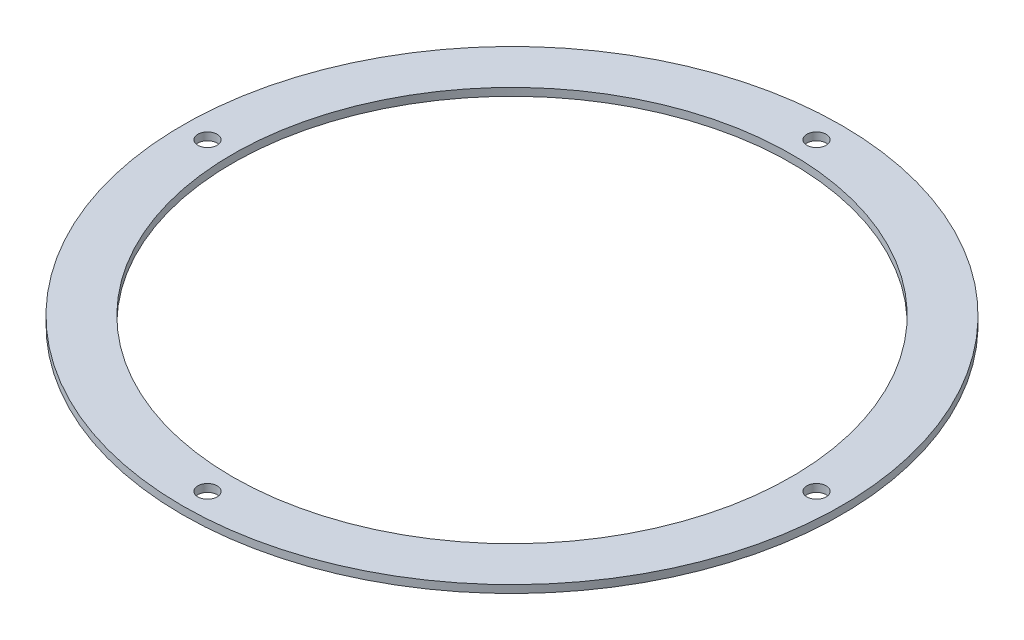
ISO-10303-21;
HEADER;
FILE_DESCRIPTION(('STEP AP214'),'2;1');
FILE_NAME('part.step','',(''),(''),'','','');
FILE_SCHEMA(('AUTOMOTIVE_DESIGN { 1 0 10303 214 1 1 1 1 }'));
ENDSEC;
DATA;
#1=APPLICATION_CONTEXT('core data for automotive mechanical design processes');
#2=APPLICATION_PROTOCOL_DEFINITION('international standard','automotive_design',2000,#1);
#3=PRODUCT_CONTEXT('',#1,'mechanical');
#4=PRODUCT('Part','Part','',(#3));
#5=PRODUCT_RELATED_PRODUCT_CATEGORY('part','',(#4));
#6=PRODUCT_DEFINITION_FORMATION('','',#4);
#7=PRODUCT_DEFINITION_CONTEXT('part definition',#1,'design');
#8=PRODUCT_DEFINITION('design','',#6,#7);
#9=PRODUCT_DEFINITION_SHAPE('','',#8);
#10=(LENGTH_UNIT() NAMED_UNIT(*) SI_UNIT(.MILLI.,.METRE.));
#11=(NAMED_UNIT(*) PLANE_ANGLE_UNIT() SI_UNIT($,.RADIAN.));
#12=(NAMED_UNIT(*) SI_UNIT($,.STERADIAN.) SOLID_ANGLE_UNIT());
#13=UNCERTAINTY_MEASURE_WITH_UNIT(LENGTH_MEASURE(1.E-05),#10,'distance_accuracy_value','');
#14=(GEOMETRIC_REPRESENTATION_CONTEXT(3) GLOBAL_UNCERTAINTY_ASSIGNED_CONTEXT((#13)) GLOBAL_UNIT_ASSIGNED_CONTEXT((#10,
#11,#12)) REPRESENTATION_CONTEXT('',''));
#15=CARTESIAN_POINT('',(0.,0.,0.));
#16=DIRECTION('',(0.,0.,1.));
#17=DIRECTION('',(1.,0.,0.));
#18=AXIS2_PLACEMENT_3D('',#15,#16,#17);
#19=CARTESIAN_POINT('',(79.,2.,2.75827025768607E-13));
#20=DIRECTION('',(0.,-1.,0.));
#21=DIRECTION('',(0.,0.,-1.));
#22=AXIS2_PLACEMENT_3D('',#19,#20,#21);
#23=CYLINDRICAL_SURFACE('',#22,2.5);
#24=CARTESIAN_POINT('',(79.,2.,2.75827025768607E-13));
#25=DIRECTION('',(0.,1.,0.));
#26=DIRECTION('',(0.,0.,1.));
#27=AXIS2_PLACEMENT_3D('',#24,#25,#26);
#28=CIRCLE('',#27,2.5);
#29=CARTESIAN_POINT('',(79.,2.,2.50000000000027));
#30=VERTEX_POINT('',#29);
#31=EDGE_CURVE('E51',#30,#30,#28,.T.);
#32=ORIENTED_EDGE('',*,*,#31,.T.);
#33=EDGE_LOOP('',(#32));
#34=FACE_BOUND('',#33,.T.);
#35=CARTESIAN_POINT('',(79.,0.,2.75827025768607E-13));
#36=DIRECTION('',(0.,1.,0.));
#37=DIRECTION('',(0.,0.,1.));
#38=AXIS2_PLACEMENT_3D('',#35,#36,#37);
#39=CIRCLE('',#38,2.5);
#40=CARTESIAN_POINT('',(79.,0.,2.50000000000027));
#41=VERTEX_POINT('',#40);
#42=EDGE_CURVE('E71',#41,#41,#39,.T.);
#43=ORIENTED_EDGE('',*,*,#42,.F.);
#44=EDGE_LOOP('',(#43));
#45=FACE_BOUND('',#44,.T.);
#46=ADVANCED_FACE('F43',(#34,#45),#23,.F.);
#47=CARTESIAN_POINT('',(-5.51654051537215E-13,2.,79.));
#48=DIRECTION('',(0.,-1.,0.));
#49=DIRECTION('',(0.,0.,-1.));
#50=AXIS2_PLACEMENT_3D('',#47,#48,#49);
#51=CYLINDRICAL_SURFACE('',#50,2.5);
#52=CARTESIAN_POINT('',(-5.51654051537215E-13,2.,79.));
#53=DIRECTION('',(0.,1.,0.));
#54=DIRECTION('',(0.,0.,1.));
#55=AXIS2_PLACEMENT_3D('',#52,#53,#54);
#56=CIRCLE('',#55,2.5);
#57=CARTESIAN_POINT('',(-5.51654051537215E-13,2.,81.5));
#58=VERTEX_POINT('',#57);
#59=EDGE_CURVE('E56',#58,#58,#56,.T.);
#60=ORIENTED_EDGE('',*,*,#59,.T.);
#61=EDGE_LOOP('',(#60));
#62=FACE_BOUND('',#61,.T.);
#63=CARTESIAN_POINT('',(-5.51654051537215E-13,0.,79.));
#64=DIRECTION('',(0.,1.,0.));
#65=DIRECTION('',(0.,0.,1.));
#66=AXIS2_PLACEMENT_3D('',#63,#64,#65);
#67=CIRCLE('',#66,2.5);
#68=CARTESIAN_POINT('',(-5.51654051537215E-13,0.,81.5));
#69=VERTEX_POINT('',#68);
#70=EDGE_CURVE('E69',#69,#69,#67,.T.);
#71=ORIENTED_EDGE('',*,*,#70,.F.);
#72=EDGE_LOOP('',(#71));
#73=FACE_BOUND('',#72,.T.);
#74=ADVANCED_FACE('F92',(#62,#73),#51,.F.);
#75=CARTESIAN_POINT('',(-79.,2.,-8.27481077305822E-13));
#76=DIRECTION('',(0.,-1.,0.));
#77=DIRECTION('',(0.,0.,-1.));
#78=AXIS2_PLACEMENT_3D('',#75,#76,#77);
#79=CYLINDRICAL_SURFACE('',#78,2.5);
#80=CARTESIAN_POINT('',(-79.,2.,-8.27481077305822E-13));
#81=DIRECTION('',(0.,1.,0.));
#82=DIRECTION('',(0.,0.,1.));
#83=AXIS2_PLACEMENT_3D('',#80,#81,#82);
#84=CIRCLE('',#83,2.5);
#85=CARTESIAN_POINT('',(-79.,2.,2.49999999999917));
#86=VERTEX_POINT('',#85);
#87=EDGE_CURVE('E85',#86,#86,#84,.T.);
#88=ORIENTED_EDGE('',*,*,#87,.T.);
#89=EDGE_LOOP('',(#88));
#90=FACE_BOUND('',#89,.T.);
#91=CARTESIAN_POINT('',(-79.,0.,-8.27481077305822E-13));
#92=DIRECTION('',(0.,1.,0.));
#93=DIRECTION('',(0.,0.,1.));
#94=AXIS2_PLACEMENT_3D('',#91,#92,#93);
#95=CIRCLE('',#94,2.5);
#96=CARTESIAN_POINT('',(-79.,0.,2.49999999999917));
#97=VERTEX_POINT('',#96);
#98=EDGE_CURVE('E66',#97,#97,#95,.T.);
#99=ORIENTED_EDGE('',*,*,#98,.F.);
#100=EDGE_LOOP('',(#99));
#101=FACE_BOUND('',#100,.T.);
#102=ADVANCED_FACE('F111',(#90,#101),#79,.F.);
#103=CARTESIAN_POINT('',(0.,2.,0.));
#104=DIRECTION('',(0.,-1.,0.));
#105=DIRECTION('',(0.,0.,-1.));
#106=AXIS2_PLACEMENT_3D('',#103,#104,#105);
#107=CYLINDRICAL_SURFACE('',#106,85.5);
#108=CARTESIAN_POINT('',(0.,2.,0.));
#109=DIRECTION('',(0.,1.,0.));
#110=DIRECTION('',(0.,0.,1.));
#111=AXIS2_PLACEMENT_3D('',#108,#109,#110);
#112=CIRCLE('',#111,85.5);
#113=CARTESIAN_POINT('',(0.,2.,85.5));
#114=VERTEX_POINT('',#113);
#115=EDGE_CURVE('E80',#114,#114,#112,.T.);
#116=ORIENTED_EDGE('',*,*,#115,.F.);
#117=EDGE_LOOP('',(#116));
#118=FACE_BOUND('',#117,.T.);
#119=CARTESIAN_POINT('',(0.,0.,0.));
#120=DIRECTION('',(0.,1.,0.));
#121=DIRECTION('',(0.,0.,1.));
#122=AXIS2_PLACEMENT_3D('',#119,#120,#121);
#123=CIRCLE('',#122,85.5);
#124=CARTESIAN_POINT('',(0.,0.,85.5));
#125=VERTEX_POINT('',#124);
#126=EDGE_CURVE('E63',#125,#125,#123,.T.);
#127=ORIENTED_EDGE('',*,*,#126,.T.);
#128=EDGE_LOOP('',(#127));
#129=FACE_BOUND('',#128,.T.);
#130=ADVANCED_FACE('F117',(#118,#129),#107,.T.);
#131=CARTESIAN_POINT('',(0.,2.,-79.));
#132=DIRECTION('',(0.,-1.,0.));
#133=DIRECTION('',(0.,0.,-1.));
#134=AXIS2_PLACEMENT_3D('',#131,#132,#133);
#135=CYLINDRICAL_SURFACE('',#134,2.5);
#136=CARTESIAN_POINT('',(0.,2.,-79.));
#137=DIRECTION('',(0.,1.,0.));
#138=DIRECTION('',(0.,0.,1.));
#139=AXIS2_PLACEMENT_3D('',#136,#137,#138);
#140=CIRCLE('',#139,2.5);
#141=CARTESIAN_POINT('',(0.,2.,-76.5));
#142=VERTEX_POINT('',#141);
#143=EDGE_CURVE('E76',#142,#142,#140,.T.);
#144=ORIENTED_EDGE('',*,*,#143,.T.);
#145=EDGE_LOOP('',(#144));
#146=FACE_BOUND('',#145,.T.);
#147=CARTESIAN_POINT('',(0.,0.,-79.));
#148=DIRECTION('',(0.,1.,0.));
#149=DIRECTION('',(0.,0.,1.));
#150=AXIS2_PLACEMENT_3D('',#147,#148,#149);
#151=CIRCLE('',#150,2.5);
#152=CARTESIAN_POINT('',(0.,0.,-76.5));
#153=VERTEX_POINT('',#152);
#154=EDGE_CURVE('E60',#153,#153,#151,.T.);
#155=ORIENTED_EDGE('',*,*,#154,.F.);
#156=EDGE_LOOP('',(#155));
#157=FACE_BOUND('',#156,.T.);
#158=ADVANCED_FACE('F45',(#146,#157),#135,.F.);
#159=CARTESIAN_POINT('',(0.,2.,0.));
#160=DIRECTION('',(0.,-1.,0.));
#161=DIRECTION('',(0.,0.,-1.));
#162=AXIS2_PLACEMENT_3D('',#159,#160,#161);
#163=CYLINDRICAL_SURFACE('',#162,72.5);
#164=CARTESIAN_POINT('',(0.,2.,0.));
#165=DIRECTION('',(0.,1.,0.));
#166=DIRECTION('',(0.,0.,1.));
#167=AXIS2_PLACEMENT_3D('',#164,#165,#166);
#168=CIRCLE('',#167,72.5);
#169=CARTESIAN_POINT('',(0.,2.,72.5));
#170=VERTEX_POINT('',#169);
#171=EDGE_CURVE('E10',#170,#170,#168,.T.);
#172=ORIENTED_EDGE('',*,*,#171,.T.);
#173=EDGE_LOOP('',(#172));
#174=FACE_BOUND('',#173,.T.);
#175=CARTESIAN_POINT('',(0.,0.,0.));
#176=DIRECTION('',(0.,1.,0.));
#177=DIRECTION('',(0.,0.,1.));
#178=AXIS2_PLACEMENT_3D('',#175,#176,#177);
#179=CIRCLE('',#178,72.5);
#180=CARTESIAN_POINT('',(0.,0.,72.5));
#181=VERTEX_POINT('',#180);
#182=EDGE_CURVE('E47',#181,#181,#179,.T.);
#183=ORIENTED_EDGE('',*,*,#182,.F.);
#184=EDGE_LOOP('',(#183));
#185=FACE_BOUND('',#184,.T.);
#186=ADVANCED_FACE('F99',(#174,#185),#163,.F.);
#187=CARTESIAN_POINT('',(0.,2.,0.));
#188=DIRECTION('',(0.,1.,0.));
#189=DIRECTION('',(0.,0.,1.));
#190=AXIS2_PLACEMENT_3D('',#187,#188,#189);
#191=PLANE('',#190);
#192=ORIENTED_EDGE('',*,*,#143,.F.);
#193=EDGE_LOOP('',(#192));
#194=FACE_BOUND('',#193,.T.);
#195=ORIENTED_EDGE('',*,*,#115,.T.);
#196=EDGE_LOOP('',(#195));
#197=FACE_BOUND('',#196,.T.);
#198=ORIENTED_EDGE('',*,*,#87,.F.);
#199=EDGE_LOOP('',(#198));
#200=FACE_BOUND('',#199,.T.);
#201=ORIENTED_EDGE('',*,*,#59,.F.);
#202=EDGE_LOOP('',(#201));
#203=FACE_BOUND('',#202,.T.);
#204=ORIENTED_EDGE('',*,*,#31,.F.);
#205=EDGE_LOOP('',(#204));
#206=FACE_BOUND('',#205,.T.);
#207=ORIENTED_EDGE('',*,*,#171,.F.);
#208=EDGE_LOOP('',(#207));
#209=FACE_BOUND('',#208,.T.);
#210=ADVANCED_FACE('F95',(#194,#197,#200,#203,#206,#209),#191,.T.);
#211=CARTESIAN_POINT('',(0.,0.,0.));
#212=DIRECTION('',(0.,1.,0.));
#213=DIRECTION('',(0.,0.,1.));
#214=AXIS2_PLACEMENT_3D('',#211,#212,#213);
#215=PLANE('',#214);
#216=ORIENTED_EDGE('',*,*,#154,.T.);
#217=EDGE_LOOP('',(#216));
#218=FACE_BOUND('',#217,.T.);
#219=ORIENTED_EDGE('',*,*,#126,.F.);
#220=EDGE_LOOP('',(#219));
#221=FACE_BOUND('',#220,.T.);
#222=ORIENTED_EDGE('',*,*,#98,.T.);
#223=EDGE_LOOP('',(#222));
#224=FACE_BOUND('',#223,.T.);
#225=ORIENTED_EDGE('',*,*,#70,.T.);
#226=EDGE_LOOP('',(#225));
#227=FACE_BOUND('',#226,.T.);
#228=ORIENTED_EDGE('',*,*,#42,.T.);
#229=EDGE_LOOP('',(#228));
#230=FACE_BOUND('',#229,.T.);
#231=ORIENTED_EDGE('',*,*,#182,.T.);
#232=EDGE_LOOP('',(#231));
#233=FACE_BOUND('',#232,.T.);
#234=ADVANCED_FACE('F98',(#218,#221,#224,#227,#230,#233),#215,.F.);
#235=CLOSED_SHELL('',(#46,#74,#102,#130,#158,#186,#210,#234));
#236=MANIFOLD_SOLID_BREP('B2',#235);
#237=ADVANCED_BREP_SHAPE_REPRESENTATION('',(#18,#236),#14);
#238=SHAPE_DEFINITION_REPRESENTATION(#9,#237);
ENDSEC;
END-ISO-10303-21;
